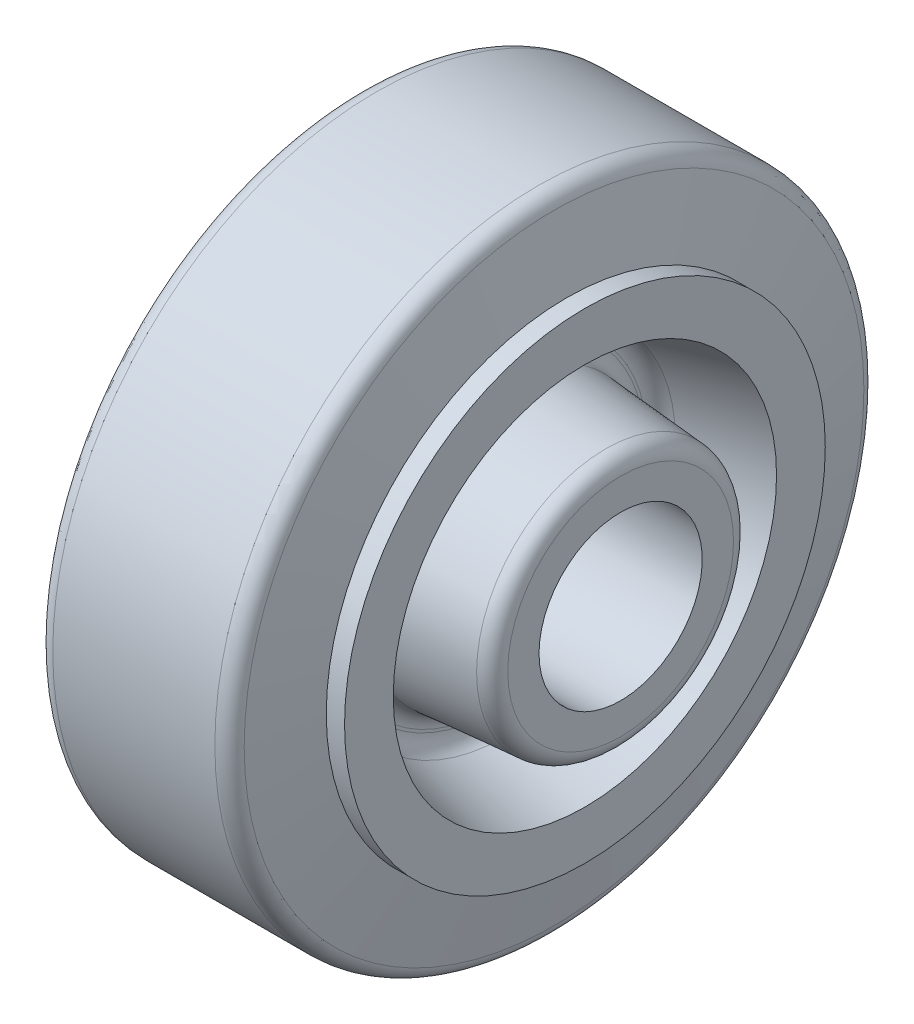
ISO-10303-21;
HEADER;
FILE_DESCRIPTION(('STEP AP214'),'2;1');
FILE_NAME('part.step','',(''),(''),'','','');
FILE_SCHEMA(('AUTOMOTIVE_DESIGN { 1 0 10303 214 1 1 1 1 }'));
ENDSEC;
DATA;
#1=APPLICATION_CONTEXT('core data for automotive mechanical design processes');
#2=APPLICATION_PROTOCOL_DEFINITION('international standard','automotive_design',2000,#1);
#3=PRODUCT_CONTEXT('',#1,'mechanical');
#4=PRODUCT('Part','Part','',(#3));
#5=PRODUCT_RELATED_PRODUCT_CATEGORY('part','',(#4));
#6=PRODUCT_DEFINITION_FORMATION('','',#4);
#7=PRODUCT_DEFINITION_CONTEXT('part definition',#1,'design');
#8=PRODUCT_DEFINITION('design','',#6,#7);
#9=PRODUCT_DEFINITION_SHAPE('','',#8);
#10=(LENGTH_UNIT() NAMED_UNIT(*) SI_UNIT(.MILLI.,.METRE.));
#11=(NAMED_UNIT(*) PLANE_ANGLE_UNIT() SI_UNIT($,.RADIAN.));
#12=(NAMED_UNIT(*) SI_UNIT($,.STERADIAN.) SOLID_ANGLE_UNIT());
#13=UNCERTAINTY_MEASURE_WITH_UNIT(LENGTH_MEASURE(1.E-05),#10,'distance_accuracy_value','');
#14=(GEOMETRIC_REPRESENTATION_CONTEXT(3) GLOBAL_UNCERTAINTY_ASSIGNED_CONTEXT((#13)) GLOBAL_UNIT_ASSIGNED_CONTEXT((#10,
#11,#12)) REPRESENTATION_CONTEXT('',''));
#15=CARTESIAN_POINT('',(0.,0.,0.));
#16=DIRECTION('',(0.,0.,1.));
#17=DIRECTION('',(1.,0.,0.));
#18=AXIS2_PLACEMENT_3D('',#15,#16,#17);
#19=CARTESIAN_POINT('',(11.65,0.,0.));
#20=DIRECTION('',(-1.,0.,0.));
#21=DIRECTION('',(0.,0.,1.));
#22=AXIS2_PLACEMENT_3D('',#19,#20,#21);
#23=CONICAL_SURFACE('',#22,39.8,1.39137423336047);
#24=CARTESIAN_POINT('',(11.9480092545903,0.,0.));
#25=DIRECTION('',(1.,0.,0.));
#26=DIRECTION('',(0.,0.,-1.));
#27=AXIS2_PLACEMENT_3D('',#24,#25,#26);
#28=CIRCLE('',#27,38.1569219476642);
#29=CARTESIAN_POINT('',(11.9480092545903,0.,-38.1569219476642));
#30=VERTEX_POINT('',#29);
#31=EDGE_CURVE('E52',#30,#30,#28,.T.);
#32=ORIENTED_EDGE('',*,*,#31,.T.);
#33=EDGE_LOOP('',(#32));
#34=FACE_BOUND('',#33,.T.);
#35=CARTESIAN_POINT('',(13.5,0.,0.));
#36=DIRECTION('',(-1.,0.,0.));
#37=DIRECTION('',(0.,0.,1.));
#38=AXIS2_PLACEMENT_3D('',#35,#36,#37);
#39=CIRCLE('',#38,29.6);
#40=CARTESIAN_POINT('',(13.5,0.,29.6));
#41=VERTEX_POINT('',#40);
#42=EDGE_CURVE('E100',#41,#41,#39,.T.);
#43=ORIENTED_EDGE('',*,*,#42,.T.);
#44=EDGE_LOOP('',(#43));
#45=FACE_BOUND('',#44,.T.);
#46=ADVANCED_FACE('F41',(#34,#45),#23,.T.);
#47=CARTESIAN_POINT('',(0.,0.,0.));
#48=DIRECTION('',(-1.,0.,0.));
#49=DIRECTION('',(0.,0.,1.));
#50=AXIS2_PLACEMENT_3D('',#47,#48,#49);
#51=CYLINDRICAL_SURFACE('',#50,29.6);
#52=CARTESIAN_POINT('',(15.75,0.,0.));
#53=DIRECTION('',(-1.,0.,0.));
#54=DIRECTION('',(0.,0.,1.));
#55=AXIS2_PLACEMENT_3D('',#52,#53,#54);
#56=CIRCLE('',#55,29.6);
#57=CARTESIAN_POINT('',(15.75,0.,29.6));
#58=VERTEX_POINT('',#57);
#59=EDGE_CURVE('E104',#58,#58,#56,.T.);
#60=ORIENTED_EDGE('',*,*,#59,.T.);
#61=EDGE_LOOP('',(#60));
#62=FACE_BOUND('',#61,.T.);
#63=ORIENTED_EDGE('',*,*,#42,.F.);
#64=EDGE_LOOP('',(#63));
#65=FACE_BOUND('',#64,.T.);
#66=ADVANCED_FACE('F146',(#62,#65),#51,.T.);
#67=CARTESIAN_POINT('',(15.75,-29.6,0.));
#68=DIRECTION('',(1.,0.,0.));
#69=DIRECTION('',(0.,0.,-1.));
#70=AXIS2_PLACEMENT_3D('',#67,#68,#69);
#71=PLANE('',#70);
#72=CARTESIAN_POINT('',(15.75,0.,0.));
#73=DIRECTION('',(-1.,0.,0.));
#74=DIRECTION('',(0.,0.,1.));
#75=AXIS2_PLACEMENT_3D('',#72,#73,#74);
#76=CIRCLE('',#75,23.6);
#77=CARTESIAN_POINT('',(15.75,0.,23.6));
#78=VERTEX_POINT('',#77);
#79=EDGE_CURVE('E108',#78,#78,#76,.T.);
#80=ORIENTED_EDGE('',*,*,#79,.T.);
#81=EDGE_LOOP('',(#80));
#82=FACE_BOUND('',#81,.T.);
#83=ORIENTED_EDGE('',*,*,#59,.F.);
#84=EDGE_LOOP('',(#83));
#85=FACE_BOUND('',#84,.T.);
#86=ADVANCED_FACE('F152',(#82,#85),#71,.T.);
#87=CARTESIAN_POINT('',(15.75,0.,0.));
#88=DIRECTION('',(1.,0.,0.));
#89=DIRECTION('',(0.,0.,-1.));
#90=AXIS2_PLACEMENT_3D('',#87,#88,#89);
#91=CONICAL_SURFACE('',#90,23.6,0.242931583079466);
#92=CARTESIAN_POINT('',(5.7689016822177,0.,0.));
#93=DIRECTION('',(1.,0.,0.));
#94=DIRECTION('',(0.,0.,-1.));
#95=AXIS2_PLACEMENT_3D('',#92,#93,#94);
#96=CIRCLE('',#95,21.1264234603757);
#97=CARTESIAN_POINT('',(5.7689016822177,0.,-21.1264234603757));
#98=VERTEX_POINT('',#97);
#99=EDGE_CURVE('E97',#98,#98,#96,.F.);
#100=ORIENTED_EDGE('',*,*,#99,.T.);
#101=EDGE_LOOP('',(#100));
#102=FACE_BOUND('',#101,.T.);
#103=ORIENTED_EDGE('',*,*,#79,.F.);
#104=EDGE_LOOP('',(#103));
#105=FACE_BOUND('',#104,.T.);
#106=ADVANCED_FACE('F202',(#102,#105),#91,.F.);
#107=CARTESIAN_POINT('',(4.25,-20.75,0.));
#108=DIRECTION('',(1.,0.,0.));
#109=DIRECTION('',(0.,0.,-1.));
#110=AXIS2_PLACEMENT_3D('',#107,#108,#109);
#111=PLANE('',#110);
#112=CARTESIAN_POINT('',(4.25,0.,0.));
#113=DIRECTION('',(1.,0.,0.));
#114=DIRECTION('',(0.,0.,-1.));
#115=AXIS2_PLACEMENT_3D('',#112,#113,#114);
#116=CIRCLE('',#115,19.1851495465173);
#117=CARTESIAN_POINT('',(4.25,0.,-19.1851495465173));
#118=VERTEX_POINT('',#117);
#119=EDGE_CURVE('E91',#118,#118,#116,.T.);
#120=ORIENTED_EDGE('',*,*,#119,.T.);
#121=EDGE_LOOP('',(#120));
#122=FACE_BOUND('',#121,.T.);
#123=CARTESIAN_POINT('',(4.25,0.,0.));
#124=DIRECTION('',(1.,0.,0.));
#125=DIRECTION('',(0.,0.,-1.));
#126=AXIS2_PLACEMENT_3D('',#123,#124,#125);
#127=CIRCLE('',#126,18.8489383060883);
#128=CARTESIAN_POINT('',(4.25,0.,-18.8489383060883));
#129=VERTEX_POINT('',#128);
#130=EDGE_CURVE('E94',#129,#129,#127,.F.);
#131=ORIENTED_EDGE('',*,*,#130,.T.);
#132=EDGE_LOOP('',(#131));
#133=FACE_BOUND('',#132,.T.);
#134=ADVANCED_FACE('F193',(#122,#133),#111,.T.);
#135=CARTESIAN_POINT('',(4.25,0.,0.));
#136=DIRECTION('',(-1.,0.,0.));
#137=DIRECTION('',(0.,0.,1.));
#138=AXIS2_PLACEMENT_3D('',#135,#136,#137);
#139=CONICAL_SURFACE('',#138,17.,0.0784549865787729);
#140=CARTESIAN_POINT('',(6.09325094562696,0.,0.));
#141=DIRECTION('',(-1.,0.,0.));
#142=DIRECTION('',(0.,0.,1.));
#143=AXIS2_PLACEMENT_3D('',#140,#141,#142);
#144=CIRCLE('',#143,16.8550903344633);
#145=CARTESIAN_POINT('',(6.09325094562696,0.,16.8550903344633));
#146=VERTEX_POINT('',#145);
#147=EDGE_CURVE('E84',#146,#146,#144,.F.);
#148=ORIENTED_EDGE('',*,*,#147,.T.);
#149=EDGE_LOOP('',(#148));
#150=FACE_BOUND('',#149,.T.);
#151=CARTESIAN_POINT('',(18.306749054373,0.,0.));
#152=DIRECTION('',(1.,0.,0.));
#153=DIRECTION('',(0.,0.,-1.));
#154=AXIS2_PLACEMENT_3D('',#151,#152,#153);
#155=CIRCLE('',#154,15.8949096655367);
#156=CARTESIAN_POINT('',(18.306749054373,0.,-15.8949096655367));
#157=VERTEX_POINT('',#156);
#158=EDGE_CURVE('E87',#157,#157,#155,.F.);
#159=ORIENTED_EDGE('',*,*,#158,.T.);
#160=EDGE_LOOP('',(#159));
#161=FACE_BOUND('',#160,.T.);
#162=ADVANCED_FACE('F190',(#150,#161),#139,.T.);
#163=CARTESIAN_POINT('',(20.15,-15.75,0.));
#164=DIRECTION('',(1.,0.,0.));
#165=DIRECTION('',(0.,0.,-1.));
#166=AXIS2_PLACEMENT_3D('',#163,#164,#165);
#167=PLANE('',#166);
#168=CARTESIAN_POINT('',(20.15,0.,0.));
#169=DIRECTION('',(1.,0.,0.));
#170=DIRECTION('',(0.,0.,-1.));
#171=AXIS2_PLACEMENT_3D('',#168,#169,#170);
#172=CIRCLE('',#171,13.9010616939117);
#173=CARTESIAN_POINT('',(20.15,0.,-13.9010616939117));
#174=VERTEX_POINT('',#173);
#175=EDGE_CURVE('E48',#174,#174,#172,.T.);
#176=ORIENTED_EDGE('',*,*,#175,.T.);
#177=EDGE_LOOP('',(#176));
#178=FACE_BOUND('',#177,.T.);
#179=CARTESIAN_POINT('',(20.15,0.,0.));
#180=DIRECTION('',(-1.,0.,0.));
#181=DIRECTION('',(0.,0.,1.));
#182=AXIS2_PLACEMENT_3D('',#179,#180,#181);
#183=CIRCLE('',#182,10.05);
#184=CARTESIAN_POINT('',(20.15,0.,10.05));
#185=VERTEX_POINT('',#184);
#186=EDGE_CURVE('E112',#185,#185,#183,.T.);
#187=ORIENTED_EDGE('',*,*,#186,.T.);
#188=EDGE_LOOP('',(#187));
#189=FACE_BOUND('',#188,.T.);
#190=ADVANCED_FACE('F192',(#178,#189),#167,.T.);
#191=CARTESIAN_POINT('',(0.,0.,0.));
#192=DIRECTION('',(-1.,0.,0.));
#193=DIRECTION('',(0.,0.,1.));
#194=AXIS2_PLACEMENT_3D('',#191,#192,#193);
#195=CYLINDRICAL_SURFACE('',#194,10.05);
#196=CARTESIAN_POINT('',(-20.15,0.,0.));
#197=DIRECTION('',(-1.,0.,0.));
#198=DIRECTION('',(0.,0.,1.));
#199=AXIS2_PLACEMENT_3D('',#196,#197,#198);
#200=CIRCLE('',#199,10.05);
#201=CARTESIAN_POINT('',(-20.15,0.,10.05));
#202=VERTEX_POINT('',#201);
#203=EDGE_CURVE('E115',#202,#202,#200,.T.);
#204=ORIENTED_EDGE('',*,*,#203,.T.);
#205=EDGE_LOOP('',(#204));
#206=FACE_BOUND('',#205,.T.);
#207=ORIENTED_EDGE('',*,*,#186,.F.);
#208=EDGE_LOOP('',(#207));
#209=FACE_BOUND('',#208,.T.);
#210=ADVANCED_FACE('F200',(#206,#209),#195,.F.);
#211=CARTESIAN_POINT('',(-20.15,-15.75,0.));
#212=DIRECTION('',(-1.,0.,0.));
#213=DIRECTION('',(0.,0.,1.));
#214=AXIS2_PLACEMENT_3D('',#211,#212,#213);
#215=PLANE('',#214);
#216=CARTESIAN_POINT('',(-20.15,0.,0.));
#217=DIRECTION('',(-1.,0.,0.));
#218=DIRECTION('',(0.,0.,1.));
#219=AXIS2_PLACEMENT_3D('',#216,#217,#218);
#220=CIRCLE('',#219,13.9010616939117);
#221=CARTESIAN_POINT('',(-20.15,0.,13.9010616939117));
#222=VERTEX_POINT('',#221);
#223=EDGE_CURVE('E10',#222,#222,#220,.T.);
#224=ORIENTED_EDGE('',*,*,#223,.T.);
#225=EDGE_LOOP('',(#224));
#226=FACE_BOUND('',#225,.T.);
#227=ORIENTED_EDGE('',*,*,#203,.F.);
#228=EDGE_LOOP('',(#227));
#229=FACE_BOUND('',#228,.T.);
#230=ADVANCED_FACE('F272',(#226,#229),#215,.T.);
#231=CARTESIAN_POINT('',(-20.15,0.,0.));
#232=DIRECTION('',(1.,0.,0.));
#233=DIRECTION('',(0.,0.,-1.));
#234=AXIS2_PLACEMENT_3D('',#231,#232,#233);
#235=CONICAL_SURFACE('',#234,15.75,0.0784549865787729);
#236=CARTESIAN_POINT('',(-6.09325094562696,0.,0.));
#237=DIRECTION('',(1.,0.,0.));
#238=DIRECTION('',(0.,0.,-1.));
#239=AXIS2_PLACEMENT_3D('',#236,#237,#238);
#240=CIRCLE('',#239,16.8550903344633);
#241=CARTESIAN_POINT('',(-6.09325094562696,0.,-16.8550903344633));
#242=VERTEX_POINT('',#241);
#243=EDGE_CURVE('E78',#242,#242,#240,.F.);
#244=ORIENTED_EDGE('',*,*,#243,.T.);
#245=EDGE_LOOP('',(#244));
#246=FACE_BOUND('',#245,.T.);
#247=CARTESIAN_POINT('',(-18.306749054373,0.,0.));
#248=DIRECTION('',(-1.,0.,0.));
#249=DIRECTION('',(0.,0.,1.));
#250=AXIS2_PLACEMENT_3D('',#247,#248,#249);
#251=CIRCLE('',#250,15.8949096655367);
#252=CARTESIAN_POINT('',(-18.306749054373,0.,15.8949096655367));
#253=VERTEX_POINT('',#252);
#254=EDGE_CURVE('E81',#253,#253,#251,.F.);
#255=ORIENTED_EDGE('',*,*,#254,.T.);
#256=EDGE_LOOP('',(#255));
#257=FACE_BOUND('',#256,.T.);
#258=ADVANCED_FACE('F349',(#246,#257),#235,.T.);
#259=CARTESIAN_POINT('',(-4.25,-20.75,0.));
#260=DIRECTION('',(-1.,0.,0.));
#261=DIRECTION('',(0.,0.,1.));
#262=AXIS2_PLACEMENT_3D('',#259,#260,#261);
#263=PLANE('',#262);
#264=CARTESIAN_POINT('',(-4.25,0.,0.));
#265=DIRECTION('',(-1.,0.,0.));
#266=DIRECTION('',(0.,0.,1.));
#267=AXIS2_PLACEMENT_3D('',#264,#265,#266);
#268=CIRCLE('',#267,18.8489383060883);
#269=CARTESIAN_POINT('',(-4.25,0.,18.8489383060883));
#270=VERTEX_POINT('',#269);
#271=EDGE_CURVE('E72',#270,#270,#268,.F.);
#272=ORIENTED_EDGE('',*,*,#271,.T.);
#273=EDGE_LOOP('',(#272));
#274=FACE_BOUND('',#273,.T.);
#275=CARTESIAN_POINT('',(-4.25,0.,0.));
#276=DIRECTION('',(-1.,0.,0.));
#277=DIRECTION('',(0.,0.,1.));
#278=AXIS2_PLACEMENT_3D('',#275,#276,#277);
#279=CIRCLE('',#278,19.1851495465173);
#280=CARTESIAN_POINT('',(-4.25,0.,19.1851495465173));
#281=VERTEX_POINT('',#280);
#282=EDGE_CURVE('E75',#281,#281,#279,.T.);
#283=ORIENTED_EDGE('',*,*,#282,.T.);
#284=EDGE_LOOP('',(#283));
#285=FACE_BOUND('',#284,.T.);
#286=ADVANCED_FACE('F340',(#274,#285),#263,.T.);
#287=CARTESIAN_POINT('',(-4.25,0.,0.));
#288=DIRECTION('',(-1.,0.,0.));
#289=DIRECTION('',(0.,0.,1.));
#290=AXIS2_PLACEMENT_3D('',#287,#288,#289);
#291=CONICAL_SURFACE('',#290,20.75,0.242931583079466);
#292=CARTESIAN_POINT('',(-5.7689016822177,0.,0.));
#293=DIRECTION('',(-1.,0.,0.));
#294=DIRECTION('',(0.,0.,1.));
#295=AXIS2_PLACEMENT_3D('',#292,#293,#294);
#296=CIRCLE('',#295,21.1264234603757);
#297=CARTESIAN_POINT('',(-5.7689016822177,0.,21.1264234603757));
#298=VERTEX_POINT('',#297);
#299=EDGE_CURVE('E69',#298,#298,#296,.F.);
#300=ORIENTED_EDGE('',*,*,#299,.T.);
#301=EDGE_LOOP('',(#300));
#302=FACE_BOUND('',#301,.T.);
#303=CARTESIAN_POINT('',(-15.75,0.,0.));
#304=DIRECTION('',(-1.,0.,0.));
#305=DIRECTION('',(0.,0.,1.));
#306=AXIS2_PLACEMENT_3D('',#303,#304,#305);
#307=CIRCLE('',#306,23.6);
#308=CARTESIAN_POINT('',(-15.75,0.,23.6));
#309=VERTEX_POINT('',#308);
#310=EDGE_CURVE('E118',#309,#309,#307,.T.);
#311=ORIENTED_EDGE('',*,*,#310,.T.);
#312=EDGE_LOOP('',(#311));
#313=FACE_BOUND('',#312,.T.);
#314=ADVANCED_FACE('F260',(#302,#313),#291,.F.);
#315=CARTESIAN_POINT('',(-15.75,-29.6,0.));
#316=DIRECTION('',(-1.,0.,0.));
#317=DIRECTION('',(0.,0.,1.));
#318=AXIS2_PLACEMENT_3D('',#315,#316,#317);
#319=PLANE('',#318);
#320=CARTESIAN_POINT('',(-15.75,0.,0.));
#321=DIRECTION('',(-1.,0.,0.));
#322=DIRECTION('',(0.,0.,1.));
#323=AXIS2_PLACEMENT_3D('',#320,#321,#322);
#324=CIRCLE('',#323,29.6);
#325=CARTESIAN_POINT('',(-15.75,0.,29.6));
#326=VERTEX_POINT('',#325);
#327=EDGE_CURVE('E121',#326,#326,#324,.T.);
#328=ORIENTED_EDGE('',*,*,#327,.T.);
#329=EDGE_LOOP('',(#328));
#330=FACE_BOUND('',#329,.T.);
#331=ORIENTED_EDGE('',*,*,#310,.F.);
#332=EDGE_LOOP('',(#331));
#333=FACE_BOUND('',#332,.T.);
#334=ADVANCED_FACE('F143',(#330,#333),#319,.T.);
#335=CARTESIAN_POINT('',(0.,0.,0.));
#336=DIRECTION('',(-1.,0.,0.));
#337=DIRECTION('',(0.,0.,1.));
#338=AXIS2_PLACEMENT_3D('',#335,#336,#337);
#339=CYLINDRICAL_SURFACE('',#338,29.6);
#340=CARTESIAN_POINT('',(-13.5,0.,0.));
#341=DIRECTION('',(-1.,0.,0.));
#342=DIRECTION('',(0.,0.,1.));
#343=AXIS2_PLACEMENT_3D('',#340,#341,#342);
#344=CIRCLE('',#343,29.6);
#345=CARTESIAN_POINT('',(-13.5,0.,29.6));
#346=VERTEX_POINT('',#345);
#347=EDGE_CURVE('E124',#346,#346,#344,.T.);
#348=ORIENTED_EDGE('',*,*,#347,.T.);
#349=EDGE_LOOP('',(#348));
#350=FACE_BOUND('',#349,.T.);
#351=ORIENTED_EDGE('',*,*,#327,.F.);
#352=EDGE_LOOP('',(#351));
#353=FACE_BOUND('',#352,.T.);
#354=ADVANCED_FACE('F128',(#350,#353),#339,.T.);
#355=CARTESIAN_POINT('',(-13.5,0.,0.));
#356=DIRECTION('',(1.,0.,0.));
#357=DIRECTION('',(0.,0.,-1.));
#358=AXIS2_PLACEMENT_3D('',#355,#356,#357);
#359=CONICAL_SURFACE('',#358,29.6,1.39137423336047);
#360=CARTESIAN_POINT('',(-11.9480092545903,0.,0.));
#361=DIRECTION('',(-1.,0.,0.));
#362=DIRECTION('',(0.,0.,1.));
#363=AXIS2_PLACEMENT_3D('',#360,#361,#362);
#364=CIRCLE('',#363,38.1569219476642);
#365=CARTESIAN_POINT('',(-11.9480092545903,0.,38.1569219476642));
#366=VERTEX_POINT('',#365);
#367=EDGE_CURVE('E66',#366,#366,#364,.T.);
#368=ORIENTED_EDGE('',*,*,#367,.T.);
#369=EDGE_LOOP('',(#368));
#370=FACE_BOUND('',#369,.T.);
#371=ORIENTED_EDGE('',*,*,#347,.F.);
#372=EDGE_LOOP('',(#371));
#373=FACE_BOUND('',#372,.T.);
#374=ADVANCED_FACE('F131',(#370,#373),#359,.T.);
#375=CARTESIAN_POINT('',(0.,0.,0.));
#376=DIRECTION('',(-1.,0.,0.));
#377=DIRECTION('',(0.,0.,1.));
#378=AXIS2_PLACEMENT_3D('',#375,#376,#377);
#379=CYLINDRICAL_SURFACE('',#378,39.8);
#380=CARTESIAN_POINT('',(-9.98011527287392,0.,0.));
#381=DIRECTION('',(1.,0.,0.));
#382=DIRECTION('',(0.,0.,-1.));
#383=AXIS2_PLACEMENT_3D('',#380,#381,#382);
#384=CIRCLE('',#383,39.8);
#385=CARTESIAN_POINT('',(-9.98011527287392,0.,-39.8));
#386=VERTEX_POINT('',#385);
#387=EDGE_CURVE('E57',#386,#386,#384,.T.);
#388=ORIENTED_EDGE('',*,*,#387,.T.);
#389=EDGE_LOOP('',(#388));
#390=FACE_BOUND('',#389,.T.);
#391=CARTESIAN_POINT('',(9.98011527287393,0.,0.));
#392=DIRECTION('',(1.,0.,0.));
#393=DIRECTION('',(0.,0.,-1.));
#394=AXIS2_PLACEMENT_3D('',#391,#392,#393);
#395=CIRCLE('',#394,39.8);
#396=CARTESIAN_POINT('',(9.98011527287393,0.,-39.8));
#397=VERTEX_POINT('',#396);
#398=EDGE_CURVE('E62',#397,#397,#395,.F.);
#399=ORIENTED_EDGE('',*,*,#398,.T.);
#400=EDGE_LOOP('',(#399));
#401=FACE_BOUND('',#400,.T.);
#402=ADVANCED_FACE('F133',(#390,#401),#379,.T.);
#403=CARTESIAN_POINT('',(6.25,0.,0.));
#404=DIRECTION('',(1.,0.,0.));
#405=DIRECTION('',(0.,0.,-1.));
#406=AXIS2_PLACEMENT_3D('',#403,#404,#405);
#407=TOROIDAL_SURFACE('',#406,19.1851495465173,2.);
#408=ORIENTED_EDGE('',*,*,#119,.F.);
#409=EDGE_LOOP('',(#408));
#410=FACE_BOUND('',#409,.T.);
#411=ORIENTED_EDGE('',*,*,#99,.F.);
#412=EDGE_LOOP('',(#411));
#413=FACE_BOUND('',#412,.T.);
#414=ADVANCED_FACE('F140',(#410,#413),#407,.F.);
#415=CARTESIAN_POINT('',(6.25,0.,0.));
#416=DIRECTION('',(1.,0.,0.));
#417=DIRECTION('',(0.,0.,-1.));
#418=AXIS2_PLACEMENT_3D('',#415,#416,#417);
#419=TOROIDAL_SURFACE('',#418,18.8489383060883,2.);
#420=ORIENTED_EDGE('',*,*,#147,.F.);
#421=EDGE_LOOP('',(#420));
#422=FACE_BOUND('',#421,.T.);
#423=ORIENTED_EDGE('',*,*,#130,.F.);
#424=EDGE_LOOP('',(#423));
#425=FACE_BOUND('',#424,.T.);
#426=ADVANCED_FACE('F160',(#422,#425),#419,.F.);
#427=CARTESIAN_POINT('',(-6.25,0.,0.));
#428=DIRECTION('',(-1.,0.,0.));
#429=DIRECTION('',(0.,0.,1.));
#430=AXIS2_PLACEMENT_3D('',#427,#428,#429);
#431=TOROIDAL_SURFACE('',#430,18.8489383060883,2.);
#432=ORIENTED_EDGE('',*,*,#271,.F.);
#433=EDGE_LOOP('',(#432));
#434=FACE_BOUND('',#433,.T.);
#435=ORIENTED_EDGE('',*,*,#243,.F.);
#436=EDGE_LOOP('',(#435));
#437=FACE_BOUND('',#436,.T.);
#438=ADVANCED_FACE('F164',(#434,#437),#431,.F.);
#439=CARTESIAN_POINT('',(-6.25,0.,0.));
#440=DIRECTION('',(-1.,0.,0.));
#441=DIRECTION('',(0.,0.,1.));
#442=AXIS2_PLACEMENT_3D('',#439,#440,#441);
#443=TOROIDAL_SURFACE('',#442,19.1851495465173,2.);
#444=ORIENTED_EDGE('',*,*,#299,.F.);
#445=EDGE_LOOP('',(#444));
#446=FACE_BOUND('',#445,.T.);
#447=ORIENTED_EDGE('',*,*,#282,.F.);
#448=EDGE_LOOP('',(#447));
#449=FACE_BOUND('',#448,.T.);
#450=ADVANCED_FACE('F168',(#446,#449),#443,.F.);
#451=CARTESIAN_POINT('',(-9.98011527287392,0.,0.));
#452=DIRECTION('',(1.,0.,0.));
#453=DIRECTION('',(0.,0.,-1.));
#454=AXIS2_PLACEMENT_3D('',#451,#452,#453);
#455=TOROIDAL_SURFACE('',#454,37.8,2.);
#456=ORIENTED_EDGE('',*,*,#387,.F.);
#457=EDGE_LOOP('',(#456));
#458=FACE_BOUND('',#457,.T.);
#459=ORIENTED_EDGE('',*,*,#367,.F.);
#460=EDGE_LOOP('',(#459));
#461=FACE_BOUND('',#460,.T.);
#462=ADVANCED_FACE('F172',(#458,#461),#455,.T.);
#463=CARTESIAN_POINT('',(9.98011527287393,0.,0.));
#464=DIRECTION('',(1.,0.,0.));
#465=DIRECTION('',(0.,0.,-1.));
#466=AXIS2_PLACEMENT_3D('',#463,#464,#465);
#467=TOROIDAL_SURFACE('',#466,37.8,2.);
#468=ORIENTED_EDGE('',*,*,#31,.F.);
#469=EDGE_LOOP('',(#468));
#470=FACE_BOUND('',#469,.T.);
#471=ORIENTED_EDGE('',*,*,#398,.F.);
#472=EDGE_LOOP('',(#471));
#473=FACE_BOUND('',#472,.T.);
#474=ADVANCED_FACE('F176',(#470,#473),#467,.T.);
#475=CARTESIAN_POINT('',(18.15,0.,0.));
#476=DIRECTION('',(1.,0.,0.));
#477=DIRECTION('',(0.,0.,-1.));
#478=AXIS2_PLACEMENT_3D('',#475,#476,#477);
#479=TOROIDAL_SURFACE('',#478,13.9010616939117,2.);
#480=ORIENTED_EDGE('',*,*,#175,.F.);
#481=EDGE_LOOP('',(#480));
#482=FACE_BOUND('',#481,.T.);
#483=ORIENTED_EDGE('',*,*,#158,.F.);
#484=EDGE_LOOP('',(#483));
#485=FACE_BOUND('',#484,.T.);
#486=ADVANCED_FACE('F179',(#482,#485),#479,.T.);
#487=CARTESIAN_POINT('',(-18.15,0.,0.));
#488=DIRECTION('',(-1.,0.,0.));
#489=DIRECTION('',(0.,0.,1.));
#490=AXIS2_PLACEMENT_3D('',#487,#488,#489);
#491=TOROIDAL_SURFACE('',#490,13.9010616939117,2.);
#492=ORIENTED_EDGE('',*,*,#254,.F.);
#493=EDGE_LOOP('',(#492));
#494=FACE_BOUND('',#493,.T.);
#495=ORIENTED_EDGE('',*,*,#223,.F.);
#496=EDGE_LOOP('',(#495));
#497=FACE_BOUND('',#496,.T.);
#498=ADVANCED_FACE('F43',(#494,#497),#491,.T.);
#499=CLOSED_SHELL('',(#46,#66,#86,#106,#134,#162,#190,#210,#230,#258,#286,#314,#334,#354,#374,
#402,#414,#426,#438,#450,#462,#474,#486,#498));
#500=MANIFOLD_SOLID_BREP('B2',#499);
#501=ADVANCED_BREP_SHAPE_REPRESENTATION('',(#18,#500),#14);
#502=SHAPE_DEFINITION_REPRESENTATION(#9,#501);
ENDSEC;
END-ISO-10303-21;
